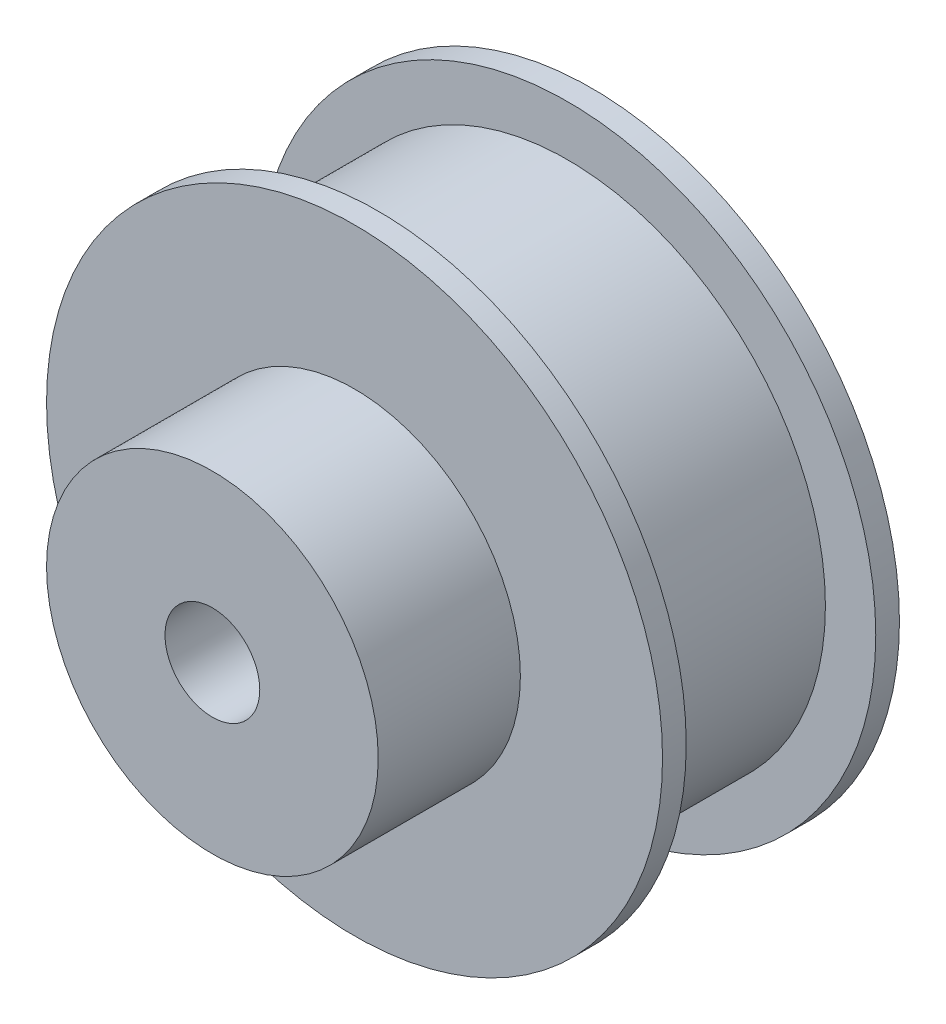
ISO-10303-21;
HEADER;
FILE_DESCRIPTION(('STEP AP214'),'2;1');
FILE_NAME('part.step','',(''),(''),'','','');
FILE_SCHEMA(('AUTOMOTIVE_DESIGN { 1 0 10303 214 1 1 1 1 }'));
ENDSEC;
DATA;
#1=APPLICATION_CONTEXT('core data for automotive mechanical design processes');
#2=APPLICATION_PROTOCOL_DEFINITION('international standard','automotive_design',2000,#1);
#3=PRODUCT_CONTEXT('',#1,'mechanical');
#4=PRODUCT('Part','Part','',(#3));
#5=PRODUCT_RELATED_PRODUCT_CATEGORY('part','',(#4));
#6=PRODUCT_DEFINITION_FORMATION('','',#4);
#7=PRODUCT_DEFINITION_CONTEXT('part definition',#1,'design');
#8=PRODUCT_DEFINITION('design','',#6,#7);
#9=PRODUCT_DEFINITION_SHAPE('','',#8);
#10=(LENGTH_UNIT() NAMED_UNIT(*) SI_UNIT(.MILLI.,.METRE.));
#11=(NAMED_UNIT(*) PLANE_ANGLE_UNIT() SI_UNIT($,.RADIAN.));
#12=(NAMED_UNIT(*) SI_UNIT($,.STERADIAN.) SOLID_ANGLE_UNIT());
#13=UNCERTAINTY_MEASURE_WITH_UNIT(LENGTH_MEASURE(1.E-05),#10,'distance_accuracy_value','');
#14=(GEOMETRIC_REPRESENTATION_CONTEXT(3) GLOBAL_UNCERTAINTY_ASSIGNED_CONTEXT((#13)) GLOBAL_UNIT_ASSIGNED_CONTEXT((#10,
#11,#12)) REPRESENTATION_CONTEXT('',''));
#15=CARTESIAN_POINT('',(0.,0.,0.));
#16=DIRECTION('',(0.,0.,1.));
#17=DIRECTION('',(1.,0.,0.));
#18=AXIS2_PLACEMENT_3D('',#15,#16,#17);
#19=CARTESIAN_POINT('',(0.,0.,10.));
#20=DIRECTION('',(0.,0.,1.));
#21=DIRECTION('',(1.,0.,0.));
#22=AXIS2_PLACEMENT_3D('',#19,#20,#21);
#23=PLANE('',#22);
#24=CARTESIAN_POINT('',(0.,0.,10.));
#25=DIRECTION('',(0.,0.,1.));
#26=DIRECTION('',(1.,0.,0.));
#27=AXIS2_PLACEMENT_3D('',#24,#25,#26);
#28=CIRCLE('',#27,13.);
#29=CARTESIAN_POINT('',(13.,0.,10.));
#30=VERTEX_POINT('',#29);
#31=EDGE_CURVE('E45',#30,#30,#28,.T.);
#32=ORIENTED_EDGE('',*,*,#31,.T.);
#33=EDGE_LOOP('',(#32));
#34=FACE_BOUND('',#33,.T.);
#35=CARTESIAN_POINT('',(0.,0.,10.));
#36=DIRECTION('',(0.,0.,1.));
#37=DIRECTION('',(1.,0.,0.));
#38=AXIS2_PLACEMENT_3D('',#35,#36,#37);
#39=CIRCLE('',#38,7.);
#40=CARTESIAN_POINT('',(7.,0.,10.));
#41=VERTEX_POINT('',#40);
#42=EDGE_CURVE('E54',#41,#41,#39,.T.);
#43=ORIENTED_EDGE('',*,*,#42,.F.);
#44=EDGE_LOOP('',(#43));
#45=FACE_BOUND('',#44,.T.);
#46=ADVANCED_FACE('F29',(#34,#45),#23,.T.);
#47=CARTESIAN_POINT('',(0.,0.,1.));
#48=DIRECTION('',(0.,0.,1.));
#49=DIRECTION('',(1.,0.,0.));
#50=AXIS2_PLACEMENT_3D('',#47,#48,#49);
#51=PLANE('',#50);
#52=CARTESIAN_POINT('',(0.,0.,1.));
#53=DIRECTION('',(0.,0.,1.));
#54=DIRECTION('',(1.,0.,0.));
#55=AXIS2_PLACEMENT_3D('',#52,#53,#54);
#56=CIRCLE('',#55,13.);
#57=CARTESIAN_POINT('',(13.,0.,1.));
#58=VERTEX_POINT('',#57);
#59=EDGE_CURVE('E10',#58,#58,#56,.T.);
#60=ORIENTED_EDGE('',*,*,#59,.T.);
#61=EDGE_LOOP('',(#60));
#62=FACE_BOUND('',#61,.T.);
#63=CARTESIAN_POINT('',(0.,0.,1.));
#64=DIRECTION('',(0.,0.,1.));
#65=DIRECTION('',(1.,0.,0.));
#66=AXIS2_PLACEMENT_3D('',#63,#64,#65);
#67=CIRCLE('',#66,10.875);
#68=CARTESIAN_POINT('',(10.875,0.,1.));
#69=VERTEX_POINT('',#68);
#70=EDGE_CURVE('E42',#69,#69,#67,.T.);
#71=ORIENTED_EDGE('',*,*,#70,.F.);
#72=EDGE_LOOP('',(#71));
#73=FACE_BOUND('',#72,.T.);
#74=ADVANCED_FACE('F89',(#62,#73),#51,.T.);
#75=CARTESIAN_POINT('',(0.,0.,1.));
#76=DIRECTION('',(0.,0.,-1.));
#77=DIRECTION('',(-1.,0.,0.));
#78=AXIS2_PLACEMENT_3D('',#75,#76,#77);
#79=CYLINDRICAL_SURFACE('',#78,13.);
#80=ORIENTED_EDGE('',*,*,#59,.F.);
#81=EDGE_LOOP('',(#80));
#82=FACE_BOUND('',#81,.T.);
#83=CARTESIAN_POINT('',(0.,0.,0.));
#84=DIRECTION('',(0.,0.,1.));
#85=DIRECTION('',(1.,0.,0.));
#86=AXIS2_PLACEMENT_3D('',#83,#84,#85);
#87=CIRCLE('',#86,13.);
#88=CARTESIAN_POINT('',(13.,0.,0.));
#89=VERTEX_POINT('',#88);
#90=EDGE_CURVE('E33',#89,#89,#87,.T.);
#91=ORIENTED_EDGE('',*,*,#90,.T.);
#92=EDGE_LOOP('',(#91));
#93=FACE_BOUND('',#92,.T.);
#94=ADVANCED_FACE('F31',(#82,#93),#79,.T.);
#95=CARTESIAN_POINT('',(0.,0.,0.));
#96=DIRECTION('',(0.,0.,1.));
#97=DIRECTION('',(1.,0.,0.));
#98=AXIS2_PLACEMENT_3D('',#95,#96,#97);
#99=PLANE('',#98);
#100=CARTESIAN_POINT('',(0.,0.,0.));
#101=DIRECTION('',(0.,0.,1.));
#102=DIRECTION('',(1.,0.,0.));
#103=AXIS2_PLACEMENT_3D('',#100,#101,#102);
#104=CIRCLE('',#103,2.);
#105=CARTESIAN_POINT('',(2.,0.,0.));
#106=VERTEX_POINT('',#105);
#107=EDGE_CURVE('E57',#106,#106,#104,.T.);
#108=ORIENTED_EDGE('',*,*,#107,.T.);
#109=EDGE_LOOP('',(#108));
#110=FACE_BOUND('',#109,.T.);
#111=ORIENTED_EDGE('',*,*,#90,.F.);
#112=EDGE_LOOP('',(#111));
#113=FACE_BOUND('',#112,.T.);
#114=ADVANCED_FACE('F66',(#110,#113),#99,.F.);
#115=CARTESIAN_POINT('',(0.,0.,9.));
#116=DIRECTION('',(0.,0.,-1.));
#117=DIRECTION('',(-1.,0.,0.));
#118=AXIS2_PLACEMENT_3D('',#115,#116,#117);
#119=CYLINDRICAL_SURFACE('',#118,10.875);
#120=CARTESIAN_POINT('',(0.,0.,9.));
#121=DIRECTION('',(0.,0.,1.));
#122=DIRECTION('',(1.,0.,0.));
#123=AXIS2_PLACEMENT_3D('',#120,#121,#122);
#124=CIRCLE('',#123,10.875);
#125=CARTESIAN_POINT('',(10.875,0.,9.));
#126=VERTEX_POINT('',#125);
#127=EDGE_CURVE('E40',#126,#126,#124,.T.);
#128=ORIENTED_EDGE('',*,*,#127,.F.);
#129=EDGE_LOOP('',(#128));
#130=FACE_BOUND('',#129,.T.);
#131=ORIENTED_EDGE('',*,*,#70,.T.);
#132=EDGE_LOOP('',(#131));
#133=FACE_BOUND('',#132,.T.);
#134=ADVANCED_FACE('F100',(#130,#133),#119,.T.);
#135=CARTESIAN_POINT('',(0.,0.,9.));
#136=DIRECTION('',(0.,0.,1.));
#137=DIRECTION('',(1.,0.,0.));
#138=AXIS2_PLACEMENT_3D('',#135,#136,#137);
#139=PLANE('',#138);
#140=CARTESIAN_POINT('',(0.,0.,9.));
#141=DIRECTION('',(0.,0.,1.));
#142=DIRECTION('',(1.,0.,0.));
#143=AXIS2_PLACEMENT_3D('',#140,#141,#142);
#144=CIRCLE('',#143,13.);
#145=CARTESIAN_POINT('',(13.,0.,9.));
#146=VERTEX_POINT('',#145);
#147=EDGE_CURVE('E48',#146,#146,#144,.T.);
#148=ORIENTED_EDGE('',*,*,#147,.F.);
#149=EDGE_LOOP('',(#148));
#150=FACE_BOUND('',#149,.T.);
#151=ORIENTED_EDGE('',*,*,#127,.T.);
#152=EDGE_LOOP('',(#151));
#153=FACE_BOUND('',#152,.T.);
#154=ADVANCED_FACE('F97',(#150,#153),#139,.F.);
#155=CARTESIAN_POINT('',(0.,0.,10.));
#156=DIRECTION('',(0.,0.,-1.));
#157=DIRECTION('',(-1.,0.,0.));
#158=AXIS2_PLACEMENT_3D('',#155,#156,#157);
#159=CYLINDRICAL_SURFACE('',#158,13.);
#160=ORIENTED_EDGE('',*,*,#31,.F.);
#161=EDGE_LOOP('',(#160));
#162=FACE_BOUND('',#161,.T.);
#163=ORIENTED_EDGE('',*,*,#147,.T.);
#164=EDGE_LOOP('',(#163));
#165=FACE_BOUND('',#164,.T.);
#166=ADVANCED_FACE('F84',(#162,#165),#159,.T.);
#167=CARTESIAN_POINT('',(0.,0.,16.));
#168=DIRECTION('',(0.,0.,-1.));
#169=DIRECTION('',(-1.,0.,0.));
#170=AXIS2_PLACEMENT_3D('',#167,#168,#169);
#171=CYLINDRICAL_SURFACE('',#170,7.);
#172=CARTESIAN_POINT('',(0.,0.,16.));
#173=DIRECTION('',(0.,0.,1.));
#174=DIRECTION('',(1.,0.,0.));
#175=AXIS2_PLACEMENT_3D('',#172,#173,#174);
#176=CIRCLE('',#175,7.);
#177=CARTESIAN_POINT('',(7.,0.,16.));
#178=VERTEX_POINT('',#177);
#179=EDGE_CURVE('E51',#178,#178,#176,.T.);
#180=ORIENTED_EDGE('',*,*,#179,.F.);
#181=EDGE_LOOP('',(#180));
#182=FACE_BOUND('',#181,.T.);
#183=ORIENTED_EDGE('',*,*,#42,.T.);
#184=EDGE_LOOP('',(#183));
#185=FACE_BOUND('',#184,.T.);
#186=ADVANCED_FACE('F78',(#182,#185),#171,.T.);
#187=CARTESIAN_POINT('',(0.,0.,16.));
#188=DIRECTION('',(0.,0.,1.));
#189=DIRECTION('',(1.,0.,0.));
#190=AXIS2_PLACEMENT_3D('',#187,#188,#189);
#191=PLANE('',#190);
#192=CARTESIAN_POINT('',(0.,0.,16.));
#193=DIRECTION('',(0.,0.,1.));
#194=DIRECTION('',(1.,0.,0.));
#195=AXIS2_PLACEMENT_3D('',#192,#193,#194);
#196=CIRCLE('',#195,2.);
#197=CARTESIAN_POINT('',(2.,0.,16.));
#198=VERTEX_POINT('',#197);
#199=EDGE_CURVE('E60',#198,#198,#196,.T.);
#200=ORIENTED_EDGE('',*,*,#199,.F.);
#201=EDGE_LOOP('',(#200));
#202=FACE_BOUND('',#201,.T.);
#203=ORIENTED_EDGE('',*,*,#179,.T.);
#204=EDGE_LOOP('',(#203));
#205=FACE_BOUND('',#204,.T.);
#206=ADVANCED_FACE('F72',(#202,#205),#191,.T.);
#207=CARTESIAN_POINT('',(0.,0.,0.));
#208=DIRECTION('',(0.,0.,1.));
#209=DIRECTION('',(1.,0.,0.));
#210=AXIS2_PLACEMENT_3D('',#207,#208,#209);
#211=CYLINDRICAL_SURFACE('',#210,2.);
#212=ORIENTED_EDGE('',*,*,#107,.F.);
#213=EDGE_LOOP('',(#212));
#214=FACE_BOUND('',#213,.T.);
#215=ORIENTED_EDGE('',*,*,#199,.T.);
#216=EDGE_LOOP('',(#215));
#217=FACE_BOUND('',#216,.T.);
#218=ADVANCED_FACE('F69',(#214,#217),#211,.F.);
#219=CLOSED_SHELL('',(#46,#74,#94,#114,#134,#154,#166,#186,#206,#218));
#220=MANIFOLD_SOLID_BREP('B2',#219);
#221=ADVANCED_BREP_SHAPE_REPRESENTATION('',(#18,#220),#14);
#222=SHAPE_DEFINITION_REPRESENTATION(#9,#221);
ENDSEC;
END-ISO-10303-21;
